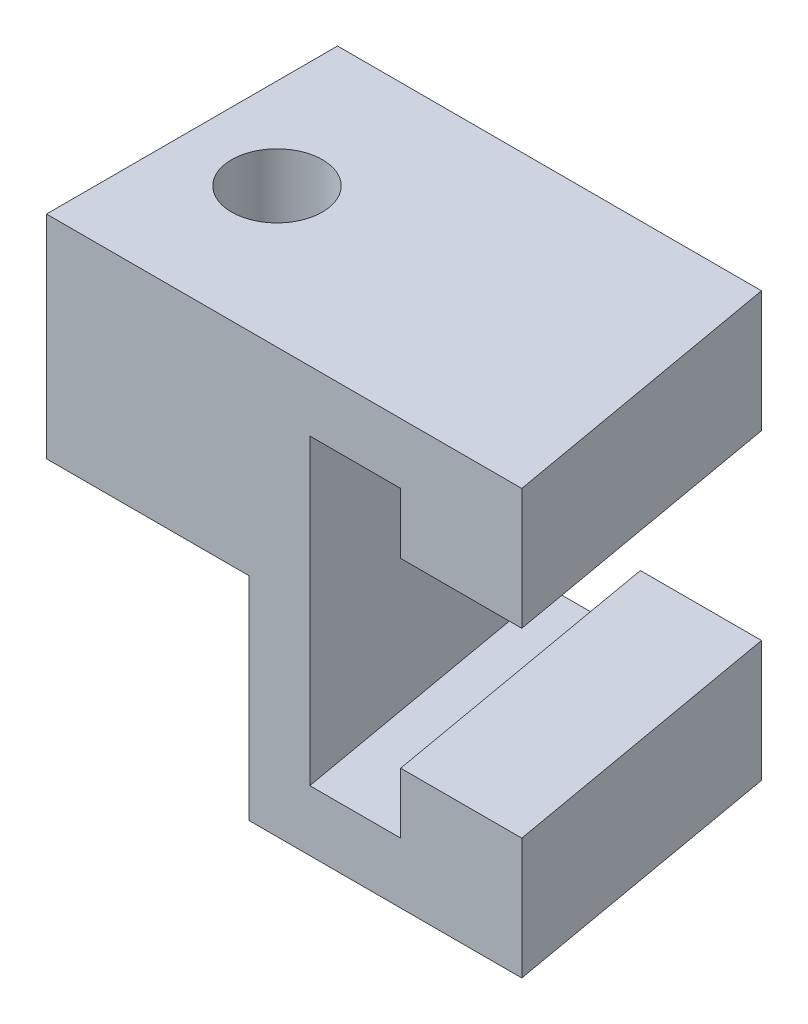
ISO-10303-21;
HEADER;
FILE_DESCRIPTION(('STEP AP214'),'2;1');
FILE_NAME('part.step','',(''),(''),'','','');
FILE_SCHEMA(('AUTOMOTIVE_DESIGN { 1 0 10303 214 1 1 1 1 }'));
ENDSEC;
DATA;
#1=APPLICATION_CONTEXT('core data for automotive mechanical design processes');
#2=APPLICATION_PROTOCOL_DEFINITION('international standard','automotive_design',2000,#1);
#3=PRODUCT_CONTEXT('',#1,'mechanical');
#4=PRODUCT('Part','Part','',(#3));
#5=PRODUCT_RELATED_PRODUCT_CATEGORY('part','',(#4));
#6=PRODUCT_DEFINITION_FORMATION('','',#4);
#7=PRODUCT_DEFINITION_CONTEXT('part definition',#1,'design');
#8=PRODUCT_DEFINITION('design','',#6,#7);
#9=PRODUCT_DEFINITION_SHAPE('','',#8);
#10=(LENGTH_UNIT() NAMED_UNIT(*) SI_UNIT(.MILLI.,.METRE.));
#11=(NAMED_UNIT(*) PLANE_ANGLE_UNIT() SI_UNIT($,.RADIAN.));
#12=(NAMED_UNIT(*) SI_UNIT($,.STERADIAN.) SOLID_ANGLE_UNIT());
#13=UNCERTAINTY_MEASURE_WITH_UNIT(LENGTH_MEASURE(1.E-05),#10,'distance_accuracy_value','');
#14=(GEOMETRIC_REPRESENTATION_CONTEXT(3) GLOBAL_UNCERTAINTY_ASSIGNED_CONTEXT((#13)) GLOBAL_UNIT_ASSIGNED_CONTEXT((#10,
#11,#12)) REPRESENTATION_CONTEXT('',''));
#15=CARTESIAN_POINT('',(0.,0.,0.));
#16=DIRECTION('',(0.,0.,1.));
#17=DIRECTION('',(1.,0.,0.));
#18=AXIS2_PLACEMENT_3D('',#15,#16,#17);
#19=CARTESIAN_POINT('',(-1.52737194708735,-35.,48.0506614408651));
#20=DIRECTION('',(0.984807753012207,0.,-0.173648177666935));
#21=DIRECTION('',(-0.173648177666935,0.,-0.984807753012207));
#22=AXIS2_PLACEMENT_3D('',#19,#20,#21);
#23=PLANE('',#22);
#24=DIRECTION('',(0.173648177666935,0.,0.984807753012207));
#25=VECTOR('',#24,1.);
#26=CARTESIAN_POINT('',(-1.52737194708736,0.,48.0506614408651));
#27=LINE('',#26,#25);
#28=CARTESIAN_POINT('',(-9.99999999999999,0.,0.));
#29=VERTEX_POINT('',#28);
#30=CARTESIAN_POINT('',(-1.52737194708736,0.,48.0506614408651));
#31=VERTEX_POINT('',#30);
#32=EDGE_CURVE('E11',#29,#31,#27,.T.);
#33=ORIENTED_EDGE('',*,*,#32,.F.);
#34=DIRECTION('',(0.,-1.,0.));
#35=VECTOR('',#34,1.);
#36=CARTESIAN_POINT('',(-9.99999999999999,-35.,0.));
#37=LINE('',#36,#35);
#38=CARTESIAN_POINT('',(-9.99999999999998,-35.,0.));
#39=VERTEX_POINT('',#38);
#40=EDGE_CURVE('E175',#29,#39,#37,.T.);
#41=ORIENTED_EDGE('',*,*,#40,.T.);
#42=DIRECTION('',(-0.173648177666935,0.,-0.984807753012207));
#43=VECTOR('',#42,1.);
#44=CARTESIAN_POINT('',(-1.52737194708735,-35.,48.0506614408651));
#45=LINE('',#44,#43);
#46=CARTESIAN_POINT('',(-1.52737194708735,-35.,48.0506614408651));
#47=VERTEX_POINT('',#46);
#48=EDGE_CURVE('E179',#47,#39,#45,.T.);
#49=ORIENTED_EDGE('',*,*,#48,.F.);
#50=DIRECTION('',(0.,-1.,0.));
#51=VECTOR('',#50,1.);
#52=CARTESIAN_POINT('',(-1.52737194708735,-35.,48.0506614408651));
#53=LINE('',#52,#51);
#54=EDGE_CURVE('E173',#31,#47,#53,.T.);
#55=ORIENTED_EDGE('',*,*,#54,.F.);
#56=EDGE_LOOP('',(#33,#41,#49,#55));
#57=FACE_BOUND('',#56,.T.);
#58=ADVANCED_FACE('F33',(#57),#23,.F.);
#59=CARTESIAN_POINT('',(8.47262805291264,0.,48.0506614408651));
#60=DIRECTION('',(0.,0.,1.));
#61=DIRECTION('',(1.,0.,0.));
#62=AXIS2_PLACEMENT_3D('',#59,#60,#61);
#63=PLANE('',#62);
#64=DIRECTION('',(1.,0.,0.));
#65=VECTOR('',#64,1.);
#66=CARTESIAN_POINT('',(0.,0.,48.0506614408651));
#67=LINE('',#66,#65);
#68=CARTESIAN_POINT('',(-35.,0.,48.0506614408651));
#69=VERTEX_POINT('',#68);
#70=EDGE_CURVE('E49',#69,#31,#67,.T.);
#71=ORIENTED_EDGE('',*,*,#70,.T.);
#72=ORIENTED_EDGE('',*,*,#54,.T.);
#73=DIRECTION('',(1.,0.,0.));
#74=VECTOR('',#73,1.);
#75=CARTESIAN_POINT('',(43.4726280529126,-35.,48.0506614408651));
#76=LINE('',#75,#74);
#77=CARTESIAN_POINT('',(43.4726280529126,-35.,48.0506614408651));
#78=VERTEX_POINT('',#77);
#79=EDGE_CURVE('E177',#47,#78,#76,.T.);
#80=ORIENTED_EDGE('',*,*,#79,.T.);
#81=DIRECTION('',(0.,1.,0.));
#82=VECTOR('',#81,1.);
#83=CARTESIAN_POINT('',(43.4726280529126,-15.,48.0506614408651));
#84=LINE('',#83,#82);
#85=CARTESIAN_POINT('',(43.4726280529126,-15.,48.0506614408651));
#86=VERTEX_POINT('',#85);
#87=EDGE_CURVE('E185',#78,#86,#84,.T.);
#88=ORIENTED_EDGE('',*,*,#87,.T.);
#89=DIRECTION('',(-1.,0.,0.));
#90=VECTOR('',#89,1.);
#91=CARTESIAN_POINT('',(23.4726280529126,-15.,48.0506614408651));
#92=LINE('',#91,#90);
#93=CARTESIAN_POINT('',(23.4726280529126,-15.,48.0506614408651));
#94=VERTEX_POINT('',#93);
#95=EDGE_CURVE('E193',#86,#94,#92,.T.);
#96=ORIENTED_EDGE('',*,*,#95,.T.);
#97=DIRECTION('',(0.,-1.,0.));
#98=VECTOR('',#97,1.);
#99=CARTESIAN_POINT('',(23.4726280529126,-25.,48.0506614408651));
#100=LINE('',#99,#98);
#101=CARTESIAN_POINT('',(23.4726280529126,-25.,48.0506614408651));
#102=VERTEX_POINT('',#101);
#103=EDGE_CURVE('E201',#94,#102,#100,.T.);
#104=ORIENTED_EDGE('',*,*,#103,.T.);
#105=DIRECTION('',(-1.,0.,0.));
#106=VECTOR('',#105,1.);
#107=CARTESIAN_POINT('',(8.47262805291264,-25.,48.0506614408651));
#108=LINE('',#107,#106);
#109=CARTESIAN_POINT('',(8.47262805291264,-25.,48.0506614408651));
#110=VERTEX_POINT('',#109);
#111=EDGE_CURVE('E209',#102,#110,#108,.T.);
#112=ORIENTED_EDGE('',*,*,#111,.T.);
#113=DIRECTION('',(0.,1.,0.));
#114=VECTOR('',#113,1.);
#115=CARTESIAN_POINT('',(8.47262805291264,25.,48.0506614408651));
#116=LINE('',#115,#114);
#117=CARTESIAN_POINT('',(8.47262805291264,25.,48.0506614408651));
#118=VERTEX_POINT('',#117);
#119=EDGE_CURVE('E217',#110,#118,#116,.T.);
#120=ORIENTED_EDGE('',*,*,#119,.T.);
#121=DIRECTION('',(1.,0.,0.));
#122=VECTOR('',#121,1.);
#123=CARTESIAN_POINT('',(8.47262805291264,25.,48.0506614408651));
#124=LINE('',#123,#122);
#125=CARTESIAN_POINT('',(23.4726280529126,25.,48.0506614408651));
#126=VERTEX_POINT('',#125);
#127=EDGE_CURVE('E225',#118,#126,#124,.T.);
#128=ORIENTED_EDGE('',*,*,#127,.T.);
#129=DIRECTION('',(0.,-1.,0.));
#130=VECTOR('',#129,1.);
#131=CARTESIAN_POINT('',(23.4726280529126,25.,48.0506614408651));
#132=LINE('',#131,#130);
#133=CARTESIAN_POINT('',(23.4726280529126,15.,48.0506614408651));
#134=VERTEX_POINT('',#133);
#135=EDGE_CURVE('E233',#126,#134,#132,.T.);
#136=ORIENTED_EDGE('',*,*,#135,.T.);
#137=DIRECTION('',(1.,0.,0.));
#138=VECTOR('',#137,1.);
#139=CARTESIAN_POINT('',(23.4726280529126,15.,48.0506614408651));
#140=LINE('',#139,#138);
#141=CARTESIAN_POINT('',(43.4726280529126,15.,48.0506614408651));
#142=VERTEX_POINT('',#141);
#143=EDGE_CURVE('E171',#134,#142,#140,.T.);
#144=ORIENTED_EDGE('',*,*,#143,.T.);
#145=DIRECTION('',(0.,1.,0.));
#146=VECTOR('',#145,1.);
#147=CARTESIAN_POINT('',(43.4726280529126,15.,48.0506614408651));
#148=LINE('',#147,#146);
#149=CARTESIAN_POINT('',(43.4726280529126,35.,48.0506614408651));
#150=VERTEX_POINT('',#149);
#151=EDGE_CURVE('E140',#142,#150,#148,.T.);
#152=ORIENTED_EDGE('',*,*,#151,.T.);
#153=DIRECTION('',(-1.,0.,0.));
#154=VECTOR('',#153,1.);
#155=CARTESIAN_POINT('',(43.4726280529126,35.,48.0506614408651));
#156=LINE('',#155,#154);
#157=CARTESIAN_POINT('',(-35.,35.,48.0506614408651));
#158=VERTEX_POINT('',#157);
#159=EDGE_CURVE('E153',#150,#158,#156,.T.);
#160=ORIENTED_EDGE('',*,*,#159,.T.);
#161=DIRECTION('',(0.,-1.,0.));
#162=VECTOR('',#161,1.);
#163=CARTESIAN_POINT('',(-35.,0.,48.0506614408651));
#164=LINE('',#163,#162);
#165=EDGE_CURVE('E141',#158,#69,#164,.T.);
#166=ORIENTED_EDGE('',*,*,#165,.T.);
#167=EDGE_LOOP('',(#71,#72,#80,#88,#96,#104,#112,#120,#128,#136,#144,#152,#160,#166));
#168=FACE_BOUND('',#167,.T.);
#169=ADVANCED_FACE('F35',(#168),#63,.T.);
#170=CARTESIAN_POINT('',(0.,0.,0.));
#171=DIRECTION('',(0.,0.,1.));
#172=DIRECTION('',(1.,0.,0.));
#173=AXIS2_PLACEMENT_3D('',#170,#171,#172);
#174=PLANE('',#173);
#175=DIRECTION('',(1.,0.,0.));
#176=VECTOR('',#175,1.);
#177=CARTESIAN_POINT('',(0.,25.,0.));
#178=LINE('',#177,#176);
#179=CARTESIAN_POINT('',(0.,25.,0.));
#180=VERTEX_POINT('',#179);
#181=CARTESIAN_POINT('',(15.,25.,0.));
#182=VERTEX_POINT('',#181);
#183=EDGE_CURVE('E230',#180,#182,#178,.T.);
#184=ORIENTED_EDGE('',*,*,#183,.F.);
#185=DIRECTION('',(0.,1.,0.));
#186=VECTOR('',#185,1.);
#187=CARTESIAN_POINT('',(0.,25.,0.));
#188=LINE('',#187,#186);
#189=CARTESIAN_POINT('',(0.,-25.,0.));
#190=VERTEX_POINT('',#189);
#191=EDGE_CURVE('E222',#190,#180,#188,.T.);
#192=ORIENTED_EDGE('',*,*,#191,.F.);
#193=DIRECTION('',(-1.,0.,0.));
#194=VECTOR('',#193,1.);
#195=CARTESIAN_POINT('',(0.,-25.,0.));
#196=LINE('',#195,#194);
#197=CARTESIAN_POINT('',(15.,-25.,0.));
#198=VERTEX_POINT('',#197);
#199=EDGE_CURVE('E214',#198,#190,#196,.T.);
#200=ORIENTED_EDGE('',*,*,#199,.F.);
#201=DIRECTION('',(0.,-1.,0.));
#202=VECTOR('',#201,1.);
#203=CARTESIAN_POINT('',(15.,-25.,0.));
#204=LINE('',#203,#202);
#205=CARTESIAN_POINT('',(15.,-15.,0.));
#206=VERTEX_POINT('',#205);
#207=EDGE_CURVE('E206',#206,#198,#204,.T.);
#208=ORIENTED_EDGE('',*,*,#207,.F.);
#209=DIRECTION('',(-1.,0.,0.));
#210=VECTOR('',#209,1.);
#211=CARTESIAN_POINT('',(15.,-15.,0.));
#212=LINE('',#211,#210);
#213=CARTESIAN_POINT('',(35.,-15.,0.));
#214=VERTEX_POINT('',#213);
#215=EDGE_CURVE('E198',#214,#206,#212,.T.);
#216=ORIENTED_EDGE('',*,*,#215,.F.);
#217=DIRECTION('',(0.,1.,0.));
#218=VECTOR('',#217,1.);
#219=CARTESIAN_POINT('',(35.,-15.,0.));
#220=LINE('',#219,#218);
#221=CARTESIAN_POINT('',(35.,-35.,0.));
#222=VERTEX_POINT('',#221);
#223=EDGE_CURVE('E190',#222,#214,#220,.T.);
#224=ORIENTED_EDGE('',*,*,#223,.F.);
#225=DIRECTION('',(1.,0.,0.));
#226=VECTOR('',#225,1.);
#227=CARTESIAN_POINT('',(35.,-35.,0.));
#228=LINE('',#227,#226);
#229=EDGE_CURVE('E182',#39,#222,#228,.T.);
#230=ORIENTED_EDGE('',*,*,#229,.F.);
#231=ORIENTED_EDGE('',*,*,#40,.F.);
#232=DIRECTION('',(1.,0.,0.));
#233=VECTOR('',#232,1.);
#234=CARTESIAN_POINT('',(0.,0.,0.));
#235=LINE('',#234,#233);
#236=CARTESIAN_POINT('',(-35.,0.,0.));
#237=VERTEX_POINT('',#236);
#238=EDGE_CURVE('E150',#237,#29,#235,.T.);
#239=ORIENTED_EDGE('',*,*,#238,.F.);
#240=DIRECTION('',(0.,-1.,0.));
#241=VECTOR('',#240,1.);
#242=CARTESIAN_POINT('',(-35.,0.,0.));
#243=LINE('',#242,#241);
#244=CARTESIAN_POINT('',(-35.,35.,0.));
#245=VERTEX_POINT('',#244);
#246=EDGE_CURVE('E149',#245,#237,#243,.T.);
#247=ORIENTED_EDGE('',*,*,#246,.F.);
#248=DIRECTION('',(-1.,0.,0.));
#249=VECTOR('',#248,1.);
#250=CARTESIAN_POINT('',(35.,35.,0.));
#251=LINE('',#250,#249);
#252=CARTESIAN_POINT('',(35.,35.,0.));
#253=VERTEX_POINT('',#252);
#254=EDGE_CURVE('E168',#253,#245,#251,.T.);
#255=ORIENTED_EDGE('',*,*,#254,.F.);
#256=DIRECTION('',(0.,1.,0.));
#257=VECTOR('',#256,1.);
#258=CARTESIAN_POINT('',(35.,15.,0.));
#259=LINE('',#258,#257);
#260=CARTESIAN_POINT('',(35.,15.,0.));
#261=VERTEX_POINT('',#260);
#262=EDGE_CURVE('E162',#261,#253,#259,.T.);
#263=ORIENTED_EDGE('',*,*,#262,.F.);
#264=DIRECTION('',(1.,0.,0.));
#265=VECTOR('',#264,1.);
#266=CARTESIAN_POINT('',(15.,15.,0.));
#267=LINE('',#266,#265);
#268=CARTESIAN_POINT('',(15.,15.,0.));
#269=VERTEX_POINT('',#268);
#270=EDGE_CURVE('E42',#269,#261,#267,.T.);
#271=ORIENTED_EDGE('',*,*,#270,.F.);
#272=DIRECTION('',(0.,-1.,0.));
#273=VECTOR('',#272,1.);
#274=CARTESIAN_POINT('',(15.,25.,0.));
#275=LINE('',#274,#273);
#276=EDGE_CURVE('E56',#182,#269,#275,.T.);
#277=ORIENTED_EDGE('',*,*,#276,.F.);
#278=EDGE_LOOP('',(#184,#192,#200,#208,#216,#224,#230,#231,#239,#247,#255,#263,#271,#277));
#279=FACE_BOUND('',#278,.T.);
#280=ADVANCED_FACE('F252',(#279),#174,.F.);
#281=CARTESIAN_POINT('',(43.4726280529126,15.,48.0506614408651));
#282=DIRECTION('',(-0.984807753012207,0.,0.173648177666935));
#283=DIRECTION('',(0.173648177666935,0.,0.984807753012207));
#284=AXIS2_PLACEMENT_3D('',#281,#282,#283);
#285=PLANE('',#284);
#286=DIRECTION('',(-0.173648177666935,0.,-0.984807753012207));
#287=VECTOR('',#286,1.);
#288=CARTESIAN_POINT('',(43.4726280529126,35.,48.0506614408651));
#289=LINE('',#288,#287);
#290=EDGE_CURVE('E164',#150,#253,#289,.T.);
#291=ORIENTED_EDGE('',*,*,#290,.F.);
#292=ORIENTED_EDGE('',*,*,#151,.F.);
#293=DIRECTION('',(-0.173648177666935,0.,-0.984807753012207));
#294=VECTOR('',#293,1.);
#295=CARTESIAN_POINT('',(43.4726280529126,15.,48.0506614408651));
#296=LINE('',#295,#294);
#297=EDGE_CURVE('E165',#142,#261,#296,.T.);
#298=ORIENTED_EDGE('',*,*,#297,.T.);
#299=ORIENTED_EDGE('',*,*,#262,.T.);
#300=EDGE_LOOP('',(#291,#292,#298,#299));
#301=FACE_BOUND('',#300,.T.);
#302=ADVANCED_FACE('F255',(#301),#285,.F.);
#303=CARTESIAN_POINT('',(43.4726280529126,35.,48.0506614408651));
#304=DIRECTION('',(0.,-1.,0.));
#305=DIRECTION('',(1.,0.,0.));
#306=AXIS2_PLACEMENT_3D('',#303,#304,#305);
#307=PLANE('',#306);
#308=CARTESIAN_POINT('',(-20.,35.,25.));
#309=DIRECTION('',(0.,1.,0.));
#310=DIRECTION('',(0.,0.,1.));
#311=AXIS2_PLACEMENT_3D('',#308,#309,#310);
#312=CIRCLE('',#311,7.5);
#313=CARTESIAN_POINT('',(-20.,35.,32.5));
#314=VERTEX_POINT('',#313);
#315=EDGE_CURVE('E319',#314,#314,#312,.T.);
#316=ORIENTED_EDGE('',*,*,#315,.F.);
#317=EDGE_LOOP('',(#316));
#318=FACE_BOUND('',#317,.T.);
#319=DIRECTION('',(0.,0.,-1.));
#320=VECTOR('',#319,1.);
#321=CARTESIAN_POINT('',(-35.,35.,97.5481361239235));
#322=LINE('',#321,#320);
#323=EDGE_CURVE('E159',#158,#245,#322,.T.);
#324=ORIENTED_EDGE('',*,*,#323,.F.);
#325=ORIENTED_EDGE('',*,*,#159,.F.);
#326=ORIENTED_EDGE('',*,*,#290,.T.);
#327=ORIENTED_EDGE('',*,*,#254,.T.);
#328=EDGE_LOOP('',(#324,#325,#326,#327));
#329=FACE_BOUND('',#328,.T.);
#330=ADVANCED_FACE('F277',(#318,#329),#307,.F.);
#331=CARTESIAN_POINT('',(43.4726280529126,-35.,48.0506614408651));
#332=DIRECTION('',(0.,1.,0.));
#333=DIRECTION('',(-1.,0.,0.));
#334=AXIS2_PLACEMENT_3D('',#331,#332,#333);
#335=PLANE('',#334);
#336=DIRECTION('',(-0.173648177666935,0.,-0.984807753012207));
#337=VECTOR('',#336,1.);
#338=CARTESIAN_POINT('',(43.4726280529126,-35.,48.0506614408651));
#339=LINE('',#338,#337);
#340=EDGE_CURVE('E187',#78,#222,#339,.T.);
#341=ORIENTED_EDGE('',*,*,#340,.F.);
#342=ORIENTED_EDGE('',*,*,#79,.F.);
#343=ORIENTED_EDGE('',*,*,#48,.T.);
#344=ORIENTED_EDGE('',*,*,#229,.T.);
#345=EDGE_LOOP('',(#341,#342,#343,#344));
#346=FACE_BOUND('',#345,.T.);
#347=ADVANCED_FACE('F279',(#346),#335,.F.);
#348=CARTESIAN_POINT('',(43.4726280529126,-15.,48.0506614408651));
#349=DIRECTION('',(-0.984807753012207,0.,0.173648177666935));
#350=DIRECTION('',(0.173648177666935,0.,0.984807753012207));
#351=AXIS2_PLACEMENT_3D('',#348,#349,#350);
#352=PLANE('',#351);
#353=DIRECTION('',(-0.173648177666935,0.,-0.984807753012207));
#354=VECTOR('',#353,1.);
#355=CARTESIAN_POINT('',(43.4726280529126,-15.,48.0506614408651));
#356=LINE('',#355,#354);
#357=EDGE_CURVE('E195',#86,#214,#356,.T.);
#358=ORIENTED_EDGE('',*,*,#357,.F.);
#359=ORIENTED_EDGE('',*,*,#87,.F.);
#360=ORIENTED_EDGE('',*,*,#340,.T.);
#361=ORIENTED_EDGE('',*,*,#223,.T.);
#362=EDGE_LOOP('',(#358,#359,#360,#361));
#363=FACE_BOUND('',#362,.T.);
#364=ADVANCED_FACE('F282',(#363),#352,.F.);
#365=CARTESIAN_POINT('',(23.4726280529126,-15.,48.0506614408651));
#366=DIRECTION('',(0.,-1.,0.));
#367=DIRECTION('',(0.,0.,-1.));
#368=AXIS2_PLACEMENT_3D('',#365,#366,#367);
#369=PLANE('',#368);
#370=DIRECTION('',(-0.173648177666935,0.,-0.984807753012207));
#371=VECTOR('',#370,1.);
#372=CARTESIAN_POINT('',(23.4726280529126,-15.,48.0506614408651));
#373=LINE('',#372,#371);
#374=EDGE_CURVE('E203',#94,#206,#373,.T.);
#375=ORIENTED_EDGE('',*,*,#374,.F.);
#376=ORIENTED_EDGE('',*,*,#95,.F.);
#377=ORIENTED_EDGE('',*,*,#357,.T.);
#378=ORIENTED_EDGE('',*,*,#215,.T.);
#379=EDGE_LOOP('',(#375,#376,#377,#378));
#380=FACE_BOUND('',#379,.T.);
#381=ADVANCED_FACE('F286',(#380),#369,.F.);
#382=CARTESIAN_POINT('',(23.4726280529126,-25.,48.0506614408651));
#383=DIRECTION('',(0.984807753012207,0.,-0.173648177666935));
#384=DIRECTION('',(-0.173648177666935,0.,-0.984807753012207));
#385=AXIS2_PLACEMENT_3D('',#382,#383,#384);
#386=PLANE('',#385);
#387=DIRECTION('',(-0.173648177666935,0.,-0.984807753012207));
#388=VECTOR('',#387,1.);
#389=CARTESIAN_POINT('',(23.4726280529126,-25.,48.0506614408651));
#390=LINE('',#389,#388);
#391=EDGE_CURVE('E211',#102,#198,#390,.T.);
#392=ORIENTED_EDGE('',*,*,#391,.F.);
#393=ORIENTED_EDGE('',*,*,#103,.F.);
#394=ORIENTED_EDGE('',*,*,#374,.T.);
#395=ORIENTED_EDGE('',*,*,#207,.T.);
#396=EDGE_LOOP('',(#392,#393,#394,#395));
#397=FACE_BOUND('',#396,.T.);
#398=ADVANCED_FACE('F290',(#397),#386,.F.);
#399=CARTESIAN_POINT('',(8.47262805291264,-25.,48.0506614408651));
#400=DIRECTION('',(0.,-1.,0.));
#401=DIRECTION('',(0.,0.,-1.));
#402=AXIS2_PLACEMENT_3D('',#399,#400,#401);
#403=PLANE('',#402);
#404=DIRECTION('',(-0.173648177666935,0.,-0.984807753012207));
#405=VECTOR('',#404,1.);
#406=CARTESIAN_POINT('',(8.47262805291264,-25.,48.0506614408651));
#407=LINE('',#406,#405);
#408=EDGE_CURVE('E219',#110,#190,#407,.T.);
#409=ORIENTED_EDGE('',*,*,#408,.F.);
#410=ORIENTED_EDGE('',*,*,#111,.F.);
#411=ORIENTED_EDGE('',*,*,#391,.T.);
#412=ORIENTED_EDGE('',*,*,#199,.T.);
#413=EDGE_LOOP('',(#409,#410,#411,#412));
#414=FACE_BOUND('',#413,.T.);
#415=ADVANCED_FACE('F294',(#414),#403,.F.);
#416=CARTESIAN_POINT('',(8.47262805291264,25.,48.0506614408651));
#417=DIRECTION('',(-0.984807753012207,0.,0.173648177666935));
#418=DIRECTION('',(0.173648177666935,0.,0.984807753012207));
#419=AXIS2_PLACEMENT_3D('',#416,#417,#418);
#420=PLANE('',#419);
#421=DIRECTION('',(-0.173648177666935,0.,-0.984807753012207));
#422=VECTOR('',#421,1.);
#423=CARTESIAN_POINT('',(8.47262805291264,25.,48.0506614408651));
#424=LINE('',#423,#422);
#425=EDGE_CURVE('E227',#118,#180,#424,.T.);
#426=ORIENTED_EDGE('',*,*,#425,.F.);
#427=ORIENTED_EDGE('',*,*,#119,.F.);
#428=ORIENTED_EDGE('',*,*,#408,.T.);
#429=ORIENTED_EDGE('',*,*,#191,.T.);
#430=EDGE_LOOP('',(#426,#427,#428,#429));
#431=FACE_BOUND('',#430,.T.);
#432=ADVANCED_FACE('F266',(#431),#420,.F.);
#433=CARTESIAN_POINT('',(8.47262805291264,25.,48.0506614408651));
#434=DIRECTION('',(0.,1.,0.));
#435=DIRECTION('',(-1.,0.,0.));
#436=AXIS2_PLACEMENT_3D('',#433,#434,#435);
#437=PLANE('',#436);
#438=DIRECTION('',(-0.173648177666935,0.,-0.984807753012207));
#439=VECTOR('',#438,1.);
#440=CARTESIAN_POINT('',(23.4726280529126,25.,48.0506614408651));
#441=LINE('',#440,#439);
#442=EDGE_CURVE('E235',#126,#182,#441,.T.);
#443=ORIENTED_EDGE('',*,*,#442,.F.);
#444=ORIENTED_EDGE('',*,*,#127,.F.);
#445=ORIENTED_EDGE('',*,*,#425,.T.);
#446=ORIENTED_EDGE('',*,*,#183,.T.);
#447=EDGE_LOOP('',(#443,#444,#445,#446));
#448=FACE_BOUND('',#447,.T.);
#449=ADVANCED_FACE('F259',(#448),#437,.F.);
#450=CARTESIAN_POINT('',(23.4726280529126,25.,48.0506614408651));
#451=DIRECTION('',(0.984807753012207,0.,-0.173648177666935));
#452=DIRECTION('',(-0.173648177666935,0.,-0.984807753012207));
#453=AXIS2_PLACEMENT_3D('',#450,#451,#452);
#454=PLANE('',#453);
#455=DIRECTION('',(-0.173648177666935,0.,-0.984807753012207));
#456=VECTOR('',#455,1.);
#457=CARTESIAN_POINT('',(23.4726280529126,15.,48.0506614408651));
#458=LINE('',#457,#456);
#459=EDGE_CURVE('E240',#134,#269,#458,.T.);
#460=ORIENTED_EDGE('',*,*,#459,.F.);
#461=ORIENTED_EDGE('',*,*,#135,.F.);
#462=ORIENTED_EDGE('',*,*,#442,.T.);
#463=ORIENTED_EDGE('',*,*,#276,.T.);
#464=EDGE_LOOP('',(#460,#461,#462,#463));
#465=FACE_BOUND('',#464,.T.);
#466=ADVANCED_FACE('F257',(#465),#454,.F.);
#467=CARTESIAN_POINT('',(23.4726280529126,15.,48.0506614408651));
#468=DIRECTION('',(0.,1.,0.));
#469=DIRECTION('',(-1.,0.,0.));
#470=AXIS2_PLACEMENT_3D('',#467,#468,#469);
#471=PLANE('',#470);
#472=ORIENTED_EDGE('',*,*,#270,.T.);
#473=ORIENTED_EDGE('',*,*,#297,.F.);
#474=ORIENTED_EDGE('',*,*,#143,.F.);
#475=ORIENTED_EDGE('',*,*,#459,.T.);
#476=EDGE_LOOP('',(#472,#473,#474,#475));
#477=FACE_BOUND('',#476,.T.);
#478=ADVANCED_FACE('F248',(#477),#471,.F.);
#479=CARTESIAN_POINT('',(0.,0.,97.5481361239235));
#480=DIRECTION('',(0.,1.,0.));
#481=DIRECTION('',(-1.,0.,0.));
#482=AXIS2_PLACEMENT_3D('',#479,#480,#481);
#483=PLANE('',#482);
#484=CARTESIAN_POINT('',(-20.,0.,25.));
#485=DIRECTION('',(0.,1.,0.));
#486=DIRECTION('',(-1.,0.,0.));
#487=AXIS2_PLACEMENT_3D('',#484,#485,#486);
#488=CIRCLE('',#487,7.5);
#489=CARTESIAN_POINT('',(-27.5,0.,25.));
#490=VERTEX_POINT('',#489);
#491=EDGE_CURVE('E37',#490,#490,#488,.T.);
#492=ORIENTED_EDGE('',*,*,#491,.T.);
#493=EDGE_LOOP('',(#492));
#494=FACE_BOUND('',#493,.T.);
#495=ORIENTED_EDGE('',*,*,#238,.T.);
#496=ORIENTED_EDGE('',*,*,#32,.T.);
#497=ORIENTED_EDGE('',*,*,#70,.F.);
#498=DIRECTION('',(0.,0.,-1.));
#499=VECTOR('',#498,1.);
#500=CARTESIAN_POINT('',(-35.,0.,97.5481361239235));
#501=LINE('',#500,#499);
#502=EDGE_CURVE('E136',#69,#237,#501,.T.);
#503=ORIENTED_EDGE('',*,*,#502,.T.);
#504=EDGE_LOOP('',(#495,#496,#497,#503));
#505=FACE_BOUND('',#504,.T.);
#506=ADVANCED_FACE('F135',(#494,#505),#483,.F.);
#507=CARTESIAN_POINT('',(-35.,0.,97.5481361239235));
#508=DIRECTION('',(1.,0.,0.));
#509=DIRECTION('',(0.,0.,-1.));
#510=AXIS2_PLACEMENT_3D('',#507,#508,#509);
#511=PLANE('',#510);
#512=ORIENTED_EDGE('',*,*,#165,.F.);
#513=ORIENTED_EDGE('',*,*,#323,.T.);
#514=ORIENTED_EDGE('',*,*,#246,.T.);
#515=ORIENTED_EDGE('',*,*,#502,.F.);
#516=EDGE_LOOP('',(#512,#513,#514,#515));
#517=FACE_BOUND('',#516,.T.);
#518=ADVANCED_FACE('F146',(#517),#511,.F.);
#519=CARTESIAN_POINT('',(-20.,-8.99999999999999,25.));
#520=DIRECTION('',(0.,1.,0.));
#521=DIRECTION('',(0.,0.,1.));
#522=AXIS2_PLACEMENT_3D('',#519,#520,#521);
#523=CYLINDRICAL_SURFACE('',#522,7.5);
#524=ORIENTED_EDGE('',*,*,#315,.T.);
#525=EDGE_LOOP('',(#524));
#526=FACE_BOUND('',#525,.T.);
#527=ORIENTED_EDGE('',*,*,#491,.F.);
#528=EDGE_LOOP('',(#527));
#529=FACE_BOUND('',#528,.T.);
#530=ADVANCED_FACE('F327',(#526,#529),#523,.F.);
#531=CLOSED_SHELL('',(#58,#169,#280,#302,#330,#347,#364,#381,#398,#415,#432,#449,#466,#478,#506,
#518,#530));
#532=MANIFOLD_SOLID_BREP('B2',#531);
#533=ADVANCED_BREP_SHAPE_REPRESENTATION('',(#18,#532),#14);
#534=SHAPE_DEFINITION_REPRESENTATION(#9,#533);
ENDSEC;
END-ISO-10303-21;
